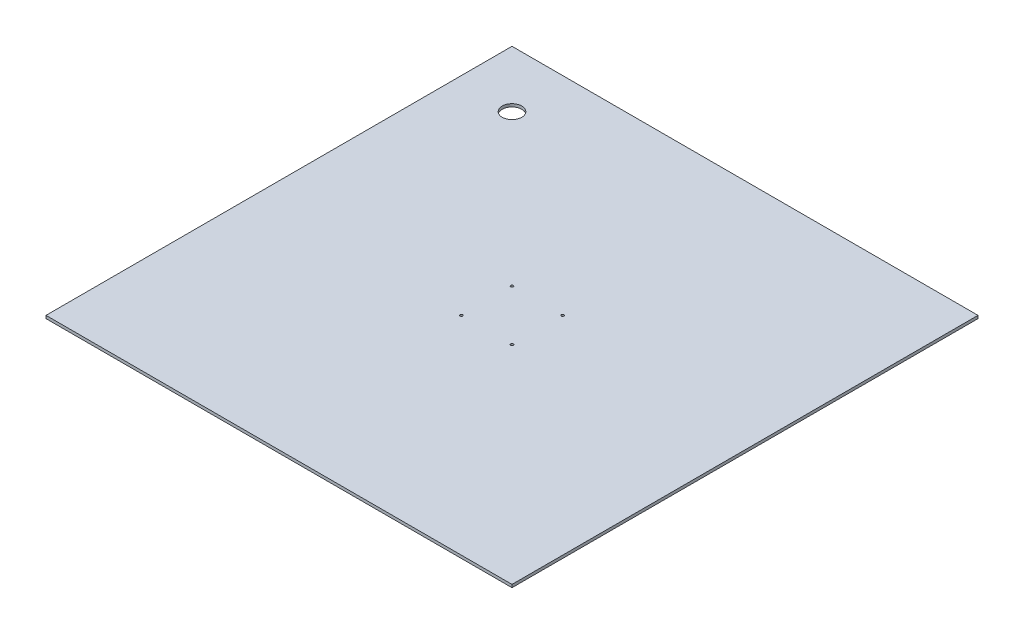
ISO-10303-21;
HEADER;
FILE_DESCRIPTION(('STEP AP214'),'2;1');
FILE_NAME('part.step','',(''),(''),'','','');
FILE_SCHEMA(('AUTOMOTIVE_DESIGN { 1 0 10303 214 1 1 1 1 }'));
ENDSEC;
DATA;
#1=APPLICATION_CONTEXT('core data for automotive mechanical design processes');
#2=APPLICATION_PROTOCOL_DEFINITION('international standard','automotive_design',2000,#1);
#3=PRODUCT_CONTEXT('',#1,'mechanical');
#4=PRODUCT('Part','Part','',(#3));
#5=PRODUCT_RELATED_PRODUCT_CATEGORY('part','',(#4));
#6=PRODUCT_DEFINITION_FORMATION('','',#4);
#7=PRODUCT_DEFINITION_CONTEXT('part definition',#1,'design');
#8=PRODUCT_DEFINITION('design','',#6,#7);
#9=PRODUCT_DEFINITION_SHAPE('','',#8);
#10=(LENGTH_UNIT() NAMED_UNIT(*) SI_UNIT(.MILLI.,.METRE.));
#11=(NAMED_UNIT(*) PLANE_ANGLE_UNIT() SI_UNIT($,.RADIAN.));
#12=(NAMED_UNIT(*) SI_UNIT($,.STERADIAN.) SOLID_ANGLE_UNIT());
#13=UNCERTAINTY_MEASURE_WITH_UNIT(LENGTH_MEASURE(1.E-05),#10,'distance_accuracy_value','');
#14=(GEOMETRIC_REPRESENTATION_CONTEXT(3) GLOBAL_UNCERTAINTY_ASSIGNED_CONTEXT((#13)) GLOBAL_UNIT_ASSIGNED_CONTEXT((#10,
#11,#12)) REPRESENTATION_CONTEXT('',''));
#15=CARTESIAN_POINT('',(0.,0.,0.));
#16=DIRECTION('',(0.,0.,1.));
#17=DIRECTION('',(1.,0.,0.));
#18=AXIS2_PLACEMENT_3D('',#15,#16,#17);
#19=CARTESIAN_POINT('',(0.,3.175,0.));
#20=DIRECTION('',(0.,1.,0.));
#21=DIRECTION('',(0.,0.,1.));
#22=AXIS2_PLACEMENT_3D('',#19,#20,#21);
#23=PLANE('',#22);
#24=CARTESIAN_POINT('',(-27.94,3.175,27.94));
#25=DIRECTION('',(0.,1.,0.));
#26=DIRECTION('',(0.,0.,-1.));
#27=AXIS2_PLACEMENT_3D('',#24,#25,#26);
#28=CIRCLE('',#27,1.45);
#29=CARTESIAN_POINT('',(-27.94,3.175,26.49));
#30=VERTEX_POINT('',#29);
#31=EDGE_CURVE('E127',#30,#30,#28,.T.);
#32=ORIENTED_EDGE('',*,*,#31,.F.);
#33=EDGE_LOOP('',(#32));
#34=FACE_BOUND('',#33,.T.);
#35=CARTESIAN_POINT('',(27.94,3.175,27.94));
#36=DIRECTION('',(0.,1.,0.));
#37=DIRECTION('',(0.,0.,1.));
#38=AXIS2_PLACEMENT_3D('',#35,#36,#37);
#39=CIRCLE('',#38,1.45);
#40=CARTESIAN_POINT('',(27.94,3.175,29.39));
#41=VERTEX_POINT('',#40);
#42=EDGE_CURVE('E133',#41,#41,#39,.T.);
#43=ORIENTED_EDGE('',*,*,#42,.F.);
#44=EDGE_LOOP('',(#43));
#45=FACE_BOUND('',#44,.T.);
#46=CARTESIAN_POINT('',(27.94,3.175,-27.9399999999999));
#47=DIRECTION('',(0.,1.,0.));
#48=DIRECTION('',(0.,0.,-1.));
#49=AXIS2_PLACEMENT_3D('',#46,#47,#48);
#50=CIRCLE('',#49,1.45);
#51=CARTESIAN_POINT('',(27.94,3.175,-29.3899999999999));
#52=VERTEX_POINT('',#51);
#53=EDGE_CURVE('E139',#52,#52,#50,.T.);
#54=ORIENTED_EDGE('',*,*,#53,.F.);
#55=EDGE_LOOP('',(#54));
#56=FACE_BOUND('',#55,.T.);
#57=CARTESIAN_POINT('',(-27.94,3.175,-27.94));
#58=DIRECTION('',(0.,1.,0.));
#59=DIRECTION('',(0.,0.,1.));
#60=AXIS2_PLACEMENT_3D('',#57,#58,#59);
#61=CIRCLE('',#60,1.45);
#62=CARTESIAN_POINT('',(-27.94,3.175,-26.49));
#63=VERTEX_POINT('',#62);
#64=EDGE_CURVE('E121',#63,#63,#61,.T.);
#65=ORIENTED_EDGE('',*,*,#64,.F.);
#66=EDGE_LOOP('',(#65));
#67=FACE_BOUND('',#66,.T.);
#68=DIRECTION('',(0.,0.,-1.));
#69=VECTOR('',#68,1.);
#70=CARTESIAN_POINT('',(257.175,3.175,-257.175));
#71=LINE('',#70,#69);
#72=CARTESIAN_POINT('',(257.175,3.175,257.175));
#73=VERTEX_POINT('',#72);
#74=CARTESIAN_POINT('',(257.175,3.175,-257.175));
#75=VERTEX_POINT('',#74);
#76=EDGE_CURVE('E88',#73,#75,#71,.T.);
#77=ORIENTED_EDGE('',*,*,#76,.T.);
#78=DIRECTION('',(-1.,0.,0.));
#79=VECTOR('',#78,1.);
#80=CARTESIAN_POINT('',(-257.175,3.175,-257.175));
#81=LINE('',#80,#79);
#82=CARTESIAN_POINT('',(-257.175,3.175,-257.175));
#83=VERTEX_POINT('',#82);
#84=EDGE_CURVE('E83',#75,#83,#81,.T.);
#85=ORIENTED_EDGE('',*,*,#84,.T.);
#86=DIRECTION('',(0.,0.,1.));
#87=VECTOR('',#86,1.);
#88=CARTESIAN_POINT('',(-257.175,3.175,-257.175));
#89=LINE('',#88,#87);
#90=CARTESIAN_POINT('',(-257.175,3.175,257.175));
#91=VERTEX_POINT('',#90);
#92=EDGE_CURVE('E86',#83,#91,#89,.T.);
#93=ORIENTED_EDGE('',*,*,#92,.T.);
#94=DIRECTION('',(1.,0.,0.));
#95=VECTOR('',#94,1.);
#96=CARTESIAN_POINT('',(-257.175,3.175,257.175));
#97=LINE('',#96,#95);
#98=EDGE_CURVE('E53',#91,#73,#97,.T.);
#99=ORIENTED_EDGE('',*,*,#98,.T.);
#100=EDGE_LOOP('',(#77,#85,#93,#99));
#101=FACE_BOUND('',#100,.T.);
#102=CARTESIAN_POINT('',(-194.722397764652,3.175,-194.722397764652));
#103=DIRECTION('',(0.,1.,0.));
#104=DIRECTION('',(0.,0.,1.));
#105=AXIS2_PLACEMENT_3D('',#102,#103,#104);
#106=CIRCLE('',#105,10.795);
#107=CARTESIAN_POINT('',(-194.722397764652,3.175,-183.927397764652));
#108=VERTEX_POINT('',#107);
#109=EDGE_CURVE('E103',#108,#108,#106,.T.);
#110=ORIENTED_EDGE('',*,*,#109,.F.);
#111=EDGE_LOOP('',(#110));
#112=FACE_BOUND('',#111,.T.);
#113=ADVANCED_FACE('F36',(#34,#45,#56,#67,#101,#112),#23,.T.);
#114=CARTESIAN_POINT('',(0.,0.,0.));
#115=DIRECTION('',(0.,1.,0.));
#116=DIRECTION('',(0.,0.,1.));
#117=AXIS2_PLACEMENT_3D('',#114,#115,#116);
#118=PLANE('',#117);
#119=CARTESIAN_POINT('',(-27.94,0.,27.94));
#120=DIRECTION('',(0.,1.,0.));
#121=DIRECTION('',(0.,0.,-1.));
#122=AXIS2_PLACEMENT_3D('',#119,#120,#121);
#123=CIRCLE('',#122,1.45);
#124=CARTESIAN_POINT('',(-27.94,0.,26.49));
#125=VERTEX_POINT('',#124);
#126=EDGE_CURVE('E130',#125,#125,#123,.T.);
#127=ORIENTED_EDGE('',*,*,#126,.T.);
#128=EDGE_LOOP('',(#127));
#129=FACE_BOUND('',#128,.T.);
#130=CARTESIAN_POINT('',(27.94,0.,27.94));
#131=DIRECTION('',(0.,1.,0.));
#132=DIRECTION('',(0.,0.,1.));
#133=AXIS2_PLACEMENT_3D('',#130,#131,#132);
#134=CIRCLE('',#133,1.45);
#135=CARTESIAN_POINT('',(27.94,0.,29.39));
#136=VERTEX_POINT('',#135);
#137=EDGE_CURVE('E136',#136,#136,#134,.T.);
#138=ORIENTED_EDGE('',*,*,#137,.T.);
#139=EDGE_LOOP('',(#138));
#140=FACE_BOUND('',#139,.T.);
#141=CARTESIAN_POINT('',(27.94,0.,-27.9399999999999));
#142=DIRECTION('',(0.,1.,0.));
#143=DIRECTION('',(0.,0.,-1.));
#144=AXIS2_PLACEMENT_3D('',#141,#142,#143);
#145=CIRCLE('',#144,1.45);
#146=CARTESIAN_POINT('',(27.94,0.,-29.3899999999999));
#147=VERTEX_POINT('',#146);
#148=EDGE_CURVE('E124',#147,#147,#145,.T.);
#149=ORIENTED_EDGE('',*,*,#148,.T.);
#150=EDGE_LOOP('',(#149));
#151=FACE_BOUND('',#150,.T.);
#152=CARTESIAN_POINT('',(-27.94,0.,-27.94));
#153=DIRECTION('',(0.,1.,0.));
#154=DIRECTION('',(0.,0.,1.));
#155=AXIS2_PLACEMENT_3D('',#152,#153,#154);
#156=CIRCLE('',#155,1.45);
#157=CARTESIAN_POINT('',(-27.94,0.,-26.49));
#158=VERTEX_POINT('',#157);
#159=EDGE_CURVE('E118',#158,#158,#156,.T.);
#160=ORIENTED_EDGE('',*,*,#159,.T.);
#161=EDGE_LOOP('',(#160));
#162=FACE_BOUND('',#161,.T.);
#163=DIRECTION('',(0.,0.,-1.));
#164=VECTOR('',#163,1.);
#165=CARTESIAN_POINT('',(257.175,0.,-257.175));
#166=LINE('',#165,#164);
#167=CARTESIAN_POINT('',(257.175,0.,257.175));
#168=VERTEX_POINT('',#167);
#169=CARTESIAN_POINT('',(257.175,0.,-257.175));
#170=VERTEX_POINT('',#169);
#171=EDGE_CURVE('E100',#168,#170,#166,.T.);
#172=ORIENTED_EDGE('',*,*,#171,.F.);
#173=DIRECTION('',(1.,0.,0.));
#174=VECTOR('',#173,1.);
#175=CARTESIAN_POINT('',(-257.175,0.,257.175));
#176=LINE('',#175,#174);
#177=CARTESIAN_POINT('',(-257.175,0.,257.175));
#178=VERTEX_POINT('',#177);
#179=EDGE_CURVE('E76',#178,#168,#176,.T.);
#180=ORIENTED_EDGE('',*,*,#179,.F.);
#181=DIRECTION('',(0.,0.,1.));
#182=VECTOR('',#181,1.);
#183=CARTESIAN_POINT('',(-257.175,0.,-257.175));
#184=LINE('',#183,#182);
#185=CARTESIAN_POINT('',(-257.175,0.,-257.175));
#186=VERTEX_POINT('',#185);
#187=EDGE_CURVE('E70',#186,#178,#184,.T.);
#188=ORIENTED_EDGE('',*,*,#187,.F.);
#189=DIRECTION('',(-1.,0.,0.));
#190=VECTOR('',#189,1.);
#191=CARTESIAN_POINT('',(-257.175,0.,-257.175));
#192=LINE('',#191,#190);
#193=EDGE_CURVE('E92',#170,#186,#192,.T.);
#194=ORIENTED_EDGE('',*,*,#193,.F.);
#195=EDGE_LOOP('',(#172,#180,#188,#194));
#196=FACE_BOUND('',#195,.T.);
#197=CARTESIAN_POINT('',(-194.722397764652,0.,-194.722397764652));
#198=DIRECTION('',(0.,1.,0.));
#199=DIRECTION('',(0.,0.,1.));
#200=AXIS2_PLACEMENT_3D('',#197,#198,#199);
#201=CIRCLE('',#200,10.795);
#202=CARTESIAN_POINT('',(-194.722397764652,0.,-183.927397764652));
#203=VERTEX_POINT('',#202);
#204=EDGE_CURVE('E115',#203,#203,#201,.T.);
#205=ORIENTED_EDGE('',*,*,#204,.T.);
#206=EDGE_LOOP('',(#205));
#207=FACE_BOUND('',#206,.T.);
#208=ADVANCED_FACE('F111',(#129,#140,#151,#162,#196,#207),#118,.F.);
#209=CARTESIAN_POINT('',(257.175,3.175,-257.175));
#210=DIRECTION('',(-1.,0.,0.));
#211=DIRECTION('',(0.,0.,1.));
#212=AXIS2_PLACEMENT_3D('',#209,#210,#211);
#213=PLANE('',#212);
#214=ORIENTED_EDGE('',*,*,#171,.T.);
#215=DIRECTION('',(0.,-1.,0.));
#216=VECTOR('',#215,1.);
#217=CARTESIAN_POINT('',(257.175,3.175,-257.175));
#218=LINE('',#217,#216);
#219=EDGE_CURVE('E11',#75,#170,#218,.T.);
#220=ORIENTED_EDGE('',*,*,#219,.F.);
#221=ORIENTED_EDGE('',*,*,#76,.F.);
#222=DIRECTION('',(0.,-1.,0.));
#223=VECTOR('',#222,1.);
#224=CARTESIAN_POINT('',(257.175,3.175,257.175));
#225=LINE('',#224,#223);
#226=EDGE_CURVE('E96',#73,#168,#225,.T.);
#227=ORIENTED_EDGE('',*,*,#226,.T.);
#228=EDGE_LOOP('',(#214,#220,#221,#227));
#229=FACE_BOUND('',#228,.T.);
#230=ADVANCED_FACE('F38',(#229),#213,.F.);
#231=CARTESIAN_POINT('',(-257.175,3.175,-257.175));
#232=DIRECTION('',(0.,0.,1.));
#233=DIRECTION('',(1.,0.,0.));
#234=AXIS2_PLACEMENT_3D('',#231,#232,#233);
#235=PLANE('',#234);
#236=ORIENTED_EDGE('',*,*,#193,.T.);
#237=DIRECTION('',(0.,-1.,0.));
#238=VECTOR('',#237,1.);
#239=CARTESIAN_POINT('',(-257.175,3.175,-257.175));
#240=LINE('',#239,#238);
#241=EDGE_CURVE('E45',#83,#186,#240,.T.);
#242=ORIENTED_EDGE('',*,*,#241,.F.);
#243=ORIENTED_EDGE('',*,*,#84,.F.);
#244=ORIENTED_EDGE('',*,*,#219,.T.);
#245=EDGE_LOOP('',(#236,#242,#243,#244));
#246=FACE_BOUND('',#245,.T.);
#247=ADVANCED_FACE('F91',(#246),#235,.F.);
#248=CARTESIAN_POINT('',(-257.175,3.175,-257.175));
#249=DIRECTION('',(1.,0.,0.));
#250=DIRECTION('',(0.,0.,-1.));
#251=AXIS2_PLACEMENT_3D('',#248,#249,#250);
#252=PLANE('',#251);
#253=ORIENTED_EDGE('',*,*,#187,.T.);
#254=DIRECTION('',(0.,-1.,0.));
#255=VECTOR('',#254,1.);
#256=CARTESIAN_POINT('',(-257.175,3.175,257.175));
#257=LINE('',#256,#255);
#258=EDGE_CURVE('E93',#91,#178,#257,.T.);
#259=ORIENTED_EDGE('',*,*,#258,.F.);
#260=ORIENTED_EDGE('',*,*,#92,.F.);
#261=ORIENTED_EDGE('',*,*,#241,.T.);
#262=EDGE_LOOP('',(#253,#259,#260,#261));
#263=FACE_BOUND('',#262,.T.);
#264=ADVANCED_FACE('F94',(#263),#252,.F.);
#265=CARTESIAN_POINT('',(-257.175,3.175,257.175));
#266=DIRECTION('',(0.,0.,-1.));
#267=DIRECTION('',(-1.,0.,0.));
#268=AXIS2_PLACEMENT_3D('',#265,#266,#267);
#269=PLANE('',#268);
#270=ORIENTED_EDGE('',*,*,#179,.T.);
#271=ORIENTED_EDGE('',*,*,#226,.F.);
#272=ORIENTED_EDGE('',*,*,#98,.F.);
#273=ORIENTED_EDGE('',*,*,#258,.T.);
#274=EDGE_LOOP('',(#270,#271,#272,#273));
#275=FACE_BOUND('',#274,.T.);
#276=ADVANCED_FACE('F108',(#275),#269,.F.);
#277=CARTESIAN_POINT('',(-194.722397764652,3.175,-194.722397764652));
#278=DIRECTION('',(0.,-1.,0.));
#279=DIRECTION('',(0.,0.,-1.));
#280=AXIS2_PLACEMENT_3D('',#277,#278,#279);
#281=CYLINDRICAL_SURFACE('',#280,10.795);
#282=ORIENTED_EDGE('',*,*,#109,.T.);
#283=EDGE_LOOP('',(#282));
#284=FACE_BOUND('',#283,.T.);
#285=ORIENTED_EDGE('',*,*,#204,.F.);
#286=EDGE_LOOP('',(#285));
#287=FACE_BOUND('',#286,.T.);
#288=ADVANCED_FACE('F162',(#284,#287),#281,.F.);
#289=CARTESIAN_POINT('',(-27.94,0.,-27.94));
#290=DIRECTION('',(0.,1.,0.));
#291=DIRECTION('',(0.,0.,1.));
#292=AXIS2_PLACEMENT_3D('',#289,#290,#291);
#293=CYLINDRICAL_SURFACE('',#292,1.45);
#294=ORIENTED_EDGE('',*,*,#159,.F.);
#295=EDGE_LOOP('',(#294));
#296=FACE_BOUND('',#295,.T.);
#297=ORIENTED_EDGE('',*,*,#64,.T.);
#298=EDGE_LOOP('',(#297));
#299=FACE_BOUND('',#298,.T.);
#300=ADVANCED_FACE('F151',(#296,#299),#293,.F.);
#301=CARTESIAN_POINT('',(27.94,0.,-27.9399999999999));
#302=DIRECTION('',(0.,1.,0.));
#303=DIRECTION('',(0.,0.,1.));
#304=AXIS2_PLACEMENT_3D('',#301,#302,#303);
#305=CYLINDRICAL_SURFACE('',#304,1.45);
#306=ORIENTED_EDGE('',*,*,#148,.F.);
#307=EDGE_LOOP('',(#306));
#308=FACE_BOUND('',#307,.T.);
#309=ORIENTED_EDGE('',*,*,#53,.T.);
#310=EDGE_LOOP('',(#309));
#311=FACE_BOUND('',#310,.T.);
#312=ADVANCED_FACE('F147',(#308,#311),#305,.F.);
#313=CARTESIAN_POINT('',(27.94,0.,27.94));
#314=DIRECTION('',(0.,1.,0.));
#315=DIRECTION('',(0.,0.,1.));
#316=AXIS2_PLACEMENT_3D('',#313,#314,#315);
#317=CYLINDRICAL_SURFACE('',#316,1.45);
#318=ORIENTED_EDGE('',*,*,#137,.F.);
#319=EDGE_LOOP('',(#318));
#320=FACE_BOUND('',#319,.T.);
#321=ORIENTED_EDGE('',*,*,#42,.T.);
#322=EDGE_LOOP('',(#321));
#323=FACE_BOUND('',#322,.T.);
#324=ADVANCED_FACE('F150',(#320,#323),#317,.F.);
#325=CARTESIAN_POINT('',(-27.94,0.,27.94));
#326=DIRECTION('',(0.,1.,0.));
#327=DIRECTION('',(0.,0.,1.));
#328=AXIS2_PLACEMENT_3D('',#325,#326,#327);
#329=CYLINDRICAL_SURFACE('',#328,1.45);
#330=ORIENTED_EDGE('',*,*,#126,.F.);
#331=EDGE_LOOP('',(#330));
#332=FACE_BOUND('',#331,.T.);
#333=ORIENTED_EDGE('',*,*,#31,.T.);
#334=EDGE_LOOP('',(#333));
#335=FACE_BOUND('',#334,.T.);
#336=ADVANCED_FACE('F172',(#332,#335),#329,.F.);
#337=CLOSED_SHELL('',(#113,#208,#230,#247,#264,#276,#288,#300,#312,#324,#336));
#338=MANIFOLD_SOLID_BREP('B2',#337);
#339=ADVANCED_BREP_SHAPE_REPRESENTATION('',(#18,#338),#14);
#340=SHAPE_DEFINITION_REPRESENTATION(#9,#339);
ENDSEC;
END-ISO-10303-21;
